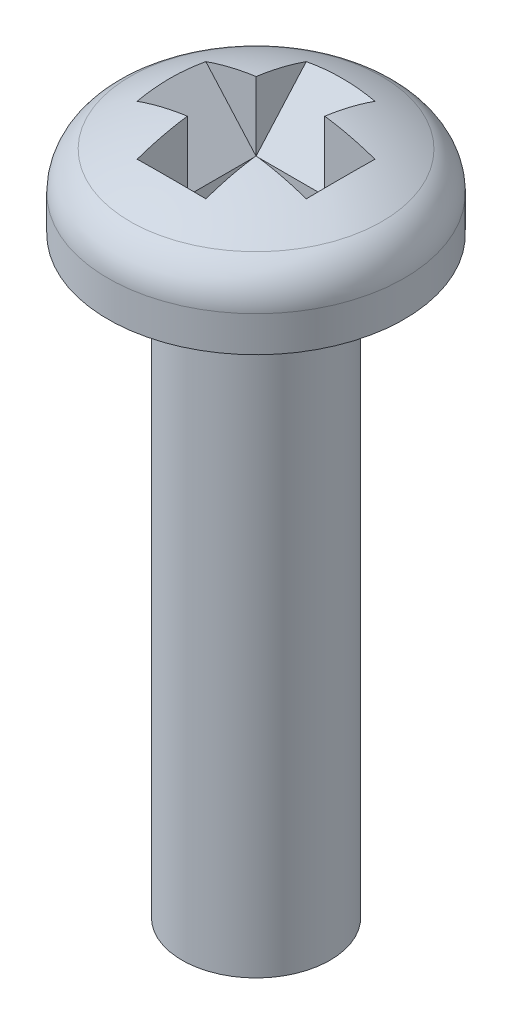
ISO-10303-21;
HEADER;
FILE_DESCRIPTION(('STEP AP214'),'2;1');
FILE_NAME('part.step','',(''),(''),'','','');
FILE_SCHEMA(('AUTOMOTIVE_DESIGN { 1 0 10303 214 1 1 1 1 }'));
ENDSEC;
DATA;
#1=APPLICATION_CONTEXT('core data for automotive mechanical design processes');
#2=APPLICATION_PROTOCOL_DEFINITION('international standard','automotive_design',2000,#1);
#3=PRODUCT_CONTEXT('',#1,'mechanical');
#4=PRODUCT('Part','Part','',(#3));
#5=PRODUCT_RELATED_PRODUCT_CATEGORY('part','',(#4));
#6=PRODUCT_DEFINITION_FORMATION('','',#4);
#7=PRODUCT_DEFINITION_CONTEXT('part definition',#1,'design');
#8=PRODUCT_DEFINITION('design','',#6,#7);
#9=PRODUCT_DEFINITION_SHAPE('','',#8);
#10=(LENGTH_UNIT() NAMED_UNIT(*) SI_UNIT(.MILLI.,.METRE.));
#11=(NAMED_UNIT(*) PLANE_ANGLE_UNIT() SI_UNIT($,.RADIAN.));
#12=(NAMED_UNIT(*) SI_UNIT($,.STERADIAN.) SOLID_ANGLE_UNIT());
#13=UNCERTAINTY_MEASURE_WITH_UNIT(LENGTH_MEASURE(1.E-05),#10,'distance_accuracy_value','');
#14=(GEOMETRIC_REPRESENTATION_CONTEXT(3) GLOBAL_UNCERTAINTY_ASSIGNED_CONTEXT((#13)) GLOBAL_UNIT_ASSIGNED_CONTEXT((#10,
#11,#12)) REPRESENTATION_CONTEXT('',''));
#15=CARTESIAN_POINT('',(0.,0.,0.));
#16=DIRECTION('',(0.,0.,1.));
#17=DIRECTION('',(1.,0.,0.));
#18=AXIS2_PLACEMENT_3D('',#15,#16,#17);
#19=CARTESIAN_POINT('',(4.038596502,4.44499615,-0.736599362));
#20=DIRECTION('',(-0.749473211781886,0.662034670407332,0.));
#21=DIRECTION('',(-0.662034670407332,-0.749473211781886,0.));
#22=AXIS2_PLACEMENT_3D('',#19,#20,#21);
#23=PLANE('',#22);
#24=DIRECTION('',(-0.662034670407332,-0.749473211781886,0.));
#25=VECTOR('',#24,1.);
#26=CARTESIAN_POINT('',(4.038596502,4.44499615,-0.736599362));
#27=LINE('',#26,#25);
#28=CARTESIAN_POINT('',(1.81311363816756,1.92558158717082,-0.736599362));
#29=VERTEX_POINT('',#28);
#30=CARTESIAN_POINT('',(0.736599362,0.706886180188679,-0.736599362));
#31=VERTEX_POINT('',#30);
#32=EDGE_CURVE('E179',#29,#31,#27,.T.);
#33=ORIENTED_EDGE('',*,*,#32,.T.);
#34=DIRECTION('',(0.,0.,1.));
#35=VECTOR('',#34,1.);
#36=CARTESIAN_POINT('',(0.736599362,0.706886180188679,-0.736599362));
#37=LINE('',#36,#35);
#38=CARTESIAN_POINT('',(0.736599362,0.706886180188679,0.736599362));
#39=VERTEX_POINT('',#38);
#40=EDGE_CURVE('E136',#31,#39,#37,.T.);
#41=ORIENTED_EDGE('',*,*,#40,.T.);
#42=DIRECTION('',(-0.662034670407332,-0.749473211781886,0.));
#43=VECTOR('',#42,1.);
#44=CARTESIAN_POINT('',(4.038596502,4.44499615,0.736599362));
#45=LINE('',#44,#43);
#46=CARTESIAN_POINT('',(1.81311363816756,1.92558158717082,0.736599362));
#47=VERTEX_POINT('',#46);
#48=EDGE_CURVE('E187',#47,#39,#45,.T.);
#49=ORIENTED_EDGE('',*,*,#48,.F.);
#50=CARTESIAN_POINT('',(-1.5284355394355,-1.8573042742666,0.));
#51=DIRECTION('',(-0.749473211781886,0.662034670407332,0.));
#52=DIRECTION('',(-0.662034670407332,-0.749473211781886,0.));
#53=AXIS2_PLACEMENT_3D('',#50,#51,#52);
#54=CIRCLE('',#53,5.10085825789167);
#55=EDGE_CURVE('E218',#29,#47,#54,.F.);
#56=ORIENTED_EDGE('',*,*,#55,.F.);
#57=EDGE_LOOP('',(#33,#41,#49,#56));
#58=FACE_BOUND('',#57,.T.);
#59=ADVANCED_FACE('F34',(#58),#23,.T.);
#60=CARTESIAN_POINT('',(-4.038596502,6.667494225,-0.736599362));
#61=DIRECTION('',(0.,0.,-1.));
#62=DIRECTION('',(-1.,0.,0.));
#63=AXIS2_PLACEMENT_3D('',#60,#61,#62);
#64=PLANE('',#63);
#65=DIRECTION('',(0.,1.,0.));
#66=VECTOR('',#65,1.);
#67=CARTESIAN_POINT('',(0.736599362,6.667494225,-0.736599362));
#68=LINE('',#67,#66);
#69=CARTESIAN_POINT('',(0.736599362,2.18632698345188,-0.736599362));
#70=VERTEX_POINT('',#69);
#71=EDGE_CURVE('E155',#31,#70,#68,.T.);
#72=ORIENTED_EDGE('',*,*,#71,.F.);
#73=ORIENTED_EDGE('',*,*,#32,.F.);
#74=CARTESIAN_POINT('',(0.,-3.20742233410129,-0.736599362));
#75=DIRECTION('',(0.,0.,-1.));
#76=DIRECTION('',(-1.,0.,0.));
#77=AXIS2_PLACEMENT_3D('',#74,#75,#76);
#78=CIRCLE('',#77,5.44381394986126);
#79=EDGE_CURVE('E222',#29,#70,#78,.F.);
#80=ORIENTED_EDGE('',*,*,#79,.T.);
#81=EDGE_LOOP('',(#72,#73,#80));
#82=FACE_BOUND('',#81,.T.);
#83=ADVANCED_FACE('F262',(#82),#64,.F.);
#84=CARTESIAN_POINT('',(-4.038596502,6.667494225,0.736599362));
#85=DIRECTION('',(0.,0.,-1.));
#86=DIRECTION('',(-1.,0.,0.));
#87=AXIS2_PLACEMENT_3D('',#84,#85,#86);
#88=PLANE('',#87);
#89=ORIENTED_EDGE('',*,*,#48,.T.);
#90=DIRECTION('',(0.,1.,0.));
#91=VECTOR('',#90,1.);
#92=CARTESIAN_POINT('',(0.736599362,6.667494225,0.736599362));
#93=LINE('',#92,#91);
#94=CARTESIAN_POINT('',(0.736599362,2.18632698345188,0.736599362));
#95=VERTEX_POINT('',#94);
#96=EDGE_CURVE('E225',#39,#95,#93,.T.);
#97=ORIENTED_EDGE('',*,*,#96,.T.);
#98=CARTESIAN_POINT('',(0.,-3.20742233410129,0.736599362));
#99=DIRECTION('',(0.,0.,-1.));
#100=DIRECTION('',(-1.,0.,0.));
#101=AXIS2_PLACEMENT_3D('',#98,#99,#100);
#102=CIRCLE('',#101,5.44381394986126);
#103=EDGE_CURVE('E212',#47,#95,#102,.F.);
#104=ORIENTED_EDGE('',*,*,#103,.F.);
#105=EDGE_LOOP('',(#89,#97,#104));
#106=FACE_BOUND('',#105,.T.);
#107=ADVANCED_FACE('F300',(#106),#88,.T.);
#108=CARTESIAN_POINT('',(0.,0.,0.));
#109=DIRECTION('',(0.,-1.,0.));
#110=DIRECTION('',(0.,0.,-1.));
#111=AXIS2_PLACEMENT_3D('',#108,#109,#110);
#112=PLANE('',#111);
#113=CARTESIAN_POINT('',(0.,0.,0.));
#114=DIRECTION('',(0.,-1.,0.));
#115=DIRECTION('',(0.,0.,-1.));
#116=AXIS2_PLACEMENT_3D('',#113,#114,#115);
#117=CIRCLE('',#116,1.5875);
#118=CARTESIAN_POINT('',(0.,0.,-1.5875));
#119=VERTEX_POINT('',#118);
#120=EDGE_CURVE('E208',#119,#119,#117,.T.);
#121=ORIENTED_EDGE('',*,*,#120,.F.);
#122=EDGE_LOOP('',(#121));
#123=FACE_BOUND('',#122,.T.);
#124=CARTESIAN_POINT('',(0.,0.,0.));
#125=DIRECTION('',(0.,-1.,0.));
#126=DIRECTION('',(0.,0.,-1.));
#127=AXIS2_PLACEMENT_3D('',#124,#125,#126);
#128=CIRCLE('',#127,3.175);
#129=CARTESIAN_POINT('',(0.,0.,-3.175));
#130=VERTEX_POINT('',#129);
#131=EDGE_CURVE('E205',#130,#130,#128,.T.);
#132=ORIENTED_EDGE('',*,*,#131,.T.);
#133=EDGE_LOOP('',(#132));
#134=FACE_BOUND('',#133,.T.);
#135=ADVANCED_FACE('F36',(#123,#134),#112,.T.);
#136=CARTESIAN_POINT('',(0.,0.,0.));
#137=DIRECTION('',(0.,-1.,0.));
#138=DIRECTION('',(0.,0.,-1.));
#139=AXIS2_PLACEMENT_3D('',#136,#137,#138);
#140=CYLINDRICAL_SURFACE('',#139,3.175);
#141=CARTESIAN_POINT('',(0.,0.762,0.));
#142=DIRECTION('',(0.,-1.,0.));
#143=DIRECTION('',(0.,0.,-1.));
#144=AXIS2_PLACEMENT_3D('',#141,#142,#143);
#145=CIRCLE('',#144,3.175);
#146=CARTESIAN_POINT('',(0.,0.762,-3.175));
#147=VERTEX_POINT('',#146);
#148=EDGE_CURVE('E202',#147,#147,#145,.T.);
#149=ORIENTED_EDGE('',*,*,#148,.T.);
#150=EDGE_LOOP('',(#149));
#151=FACE_BOUND('',#150,.T.);
#152=ORIENTED_EDGE('',*,*,#131,.F.);
#153=EDGE_LOOP('',(#152));
#154=FACE_BOUND('',#153,.T.);
#155=ADVANCED_FACE('F307',(#151,#154),#140,.T.);
#156=CARTESIAN_POINT('',(0.,0.762,0.));
#157=DIRECTION('',(0.,-1.,0.));
#158=DIRECTION('',(0.,0.,-1.));
#159=AXIS2_PLACEMENT_3D('',#156,#157,#158);
#160=TOROIDAL_SURFACE('',#159,2.23885687143939,0.936143128560607);
#161=CARTESIAN_POINT('',(0.,1.57738726833022,0.));
#162=DIRECTION('',(0.,-1.,0.));
#163=DIRECTION('',(0.,0.,-1.));
#164=AXIS2_PLACEMENT_3D('',#161,#162,#163);
#165=CIRCLE('',#164,2.6987563819808);
#166=CARTESIAN_POINT('',(0.,1.57738726833022,-2.6987563819808));
#167=VERTEX_POINT('',#166);
#168=EDGE_CURVE('E199',#167,#167,#165,.T.);
#169=ORIENTED_EDGE('',*,*,#168,.T.);
#170=EDGE_LOOP('',(#169));
#171=FACE_BOUND('',#170,.T.);
#172=ORIENTED_EDGE('',*,*,#148,.F.);
#173=EDGE_LOOP('',(#172));
#174=FACE_BOUND('',#173,.T.);
#175=ADVANCED_FACE('F488',(#171,#174),#160,.T.);
#176=CARTESIAN_POINT('',(0.,-3.20742233410129,0.));
#177=DIRECTION('',(0.,-1.,0.));
#178=DIRECTION('',(1.,0.,0.));
#179=AXIS2_PLACEMENT_3D('',#176,#177,#178);
#180=SPHERICAL_SURFACE('',#179,5.49342233410129);
#181=CARTESIAN_POINT('',(-0.736599362,-3.20742233410129,0.));
#182=DIRECTION('',(-1.,0.,0.));
#183=DIRECTION('',(0.,0.,1.));
#184=AXIS2_PLACEMENT_3D('',#181,#182,#183);
#185=CIRCLE('',#184,5.44381394986126);
#186=CARTESIAN_POINT('',(-0.736599362,1.92558158717082,-1.81311363816756));
#187=VERTEX_POINT('',#186);
#188=CARTESIAN_POINT('',(-0.736599362,2.18632698345188,-0.736599362));
#189=VERTEX_POINT('',#188);
#190=EDGE_CURVE('E162',#187,#189,#185,.F.);
#191=ORIENTED_EDGE('',*,*,#190,.F.);
#192=CARTESIAN_POINT('',(0.,-1.8573042742666,1.5284355394355));
#193=DIRECTION('',(0.,0.662034670407332,0.749473211781886));
#194=DIRECTION('',(0.,-0.749473211781886,0.662034670407332));
#195=AXIS2_PLACEMENT_3D('',#192,#193,#194);
#196=CIRCLE('',#195,5.10085825789167);
#197=CARTESIAN_POINT('',(0.736599362,1.92558158717082,-1.81311363816756));
#198=VERTEX_POINT('',#197);
#199=EDGE_CURVE('E175',#187,#198,#196,.F.);
#200=ORIENTED_EDGE('',*,*,#199,.T.);
#201=CARTESIAN_POINT('',(0.736599362,-3.20742233410129,0.));
#202=DIRECTION('',(-1.,0.,0.));
#203=DIRECTION('',(0.,0.,1.));
#204=AXIS2_PLACEMENT_3D('',#201,#202,#203);
#205=CIRCLE('',#204,5.44381394986126);
#206=EDGE_CURVE('E156',#198,#70,#205,.F.);
#207=ORIENTED_EDGE('',*,*,#206,.T.);
#208=ORIENTED_EDGE('',*,*,#79,.F.);
#209=ORIENTED_EDGE('',*,*,#55,.T.);
#210=ORIENTED_EDGE('',*,*,#103,.T.);
#211=CARTESIAN_POINT('',(0.736599362,1.92558158717082,1.81311363816756));
#212=VERTEX_POINT('',#211);
#213=EDGE_CURVE('E152',#95,#212,#205,.F.);
#214=ORIENTED_EDGE('',*,*,#213,.T.);
#215=CARTESIAN_POINT('',(0.,-1.8573042742666,-1.5284355394355));
#216=DIRECTION('',(0.,0.662034670407332,-0.749473211781886));
#217=DIRECTION('',(0.,0.749473211781886,0.662034670407332));
#218=AXIS2_PLACEMENT_3D('',#215,#216,#217);
#219=CIRCLE('',#218,5.10085825789167);
#220=CARTESIAN_POINT('',(-0.736599362,1.92558158717082,1.81311363816756));
#221=VERTEX_POINT('',#220);
#222=EDGE_CURVE('E168',#212,#221,#219,.F.);
#223=ORIENTED_EDGE('',*,*,#222,.T.);
#224=CARTESIAN_POINT('',(-0.736599362,2.18632698345188,0.736599362));
#225=VERTEX_POINT('',#224);
#226=EDGE_CURVE('E159',#225,#221,#185,.F.);
#227=ORIENTED_EDGE('',*,*,#226,.F.);
#228=CARTESIAN_POINT('',(-1.81311363816756,1.92558158717082,0.736599362));
#229=VERTEX_POINT('',#228);
#230=EDGE_CURVE('E211',#225,#229,#102,.F.);
#231=ORIENTED_EDGE('',*,*,#230,.T.);
#232=CARTESIAN_POINT('',(1.5284355394355,-1.8573042742666,0.));
#233=DIRECTION('',(0.749473211781886,0.662034670407332,0.));
#234=DIRECTION('',(-0.662034670407332,0.749473211781886,0.));
#235=AXIS2_PLACEMENT_3D('',#232,#233,#234);
#236=CIRCLE('',#235,5.10085825789167);
#237=CARTESIAN_POINT('',(-1.81311363816756,1.92558158717082,-0.736599362));
#238=VERTEX_POINT('',#237);
#239=EDGE_CURVE('E215',#229,#238,#236,.F.);
#240=ORIENTED_EDGE('',*,*,#239,.T.);
#241=EDGE_CURVE('E221',#189,#238,#78,.F.);
#242=ORIENTED_EDGE('',*,*,#241,.F.);
#243=EDGE_LOOP('',(#191,#200,#207,#208,#209,#210,#214,#223,#227,#231,#240,#242));
#244=FACE_BOUND('',#243,.T.);
#245=ORIENTED_EDGE('',*,*,#168,.F.);
#246=EDGE_LOOP('',(#245));
#247=FACE_BOUND('',#246,.T.);
#248=ADVANCED_FACE('F238',(#244,#247),#180,.T.);
#249=CARTESIAN_POINT('',(0.,-12.7,0.));
#250=DIRECTION('',(0.,-1.,0.));
#251=DIRECTION('',(0.,0.,-1.));
#252=AXIS2_PLACEMENT_3D('',#249,#250,#251);
#253=PLANE('',#252);
#254=CARTESIAN_POINT('',(0.,-12.7,0.));
#255=DIRECTION('',(0.,-1.,0.));
#256=DIRECTION('',(0.,0.,-1.));
#257=AXIS2_PLACEMENT_3D('',#254,#255,#256);
#258=CIRCLE('',#257,1.5875);
#259=CARTESIAN_POINT('',(0.,-12.7,-1.5875));
#260=VERTEX_POINT('',#259);
#261=EDGE_CURVE('E196',#260,#260,#258,.T.);
#262=ORIENTED_EDGE('',*,*,#261,.T.);
#263=EDGE_LOOP('',(#262));
#264=FACE_BOUND('',#263,.T.);
#265=ADVANCED_FACE('F487',(#264),#253,.T.);
#266=CARTESIAN_POINT('',(0.,0.,0.));
#267=DIRECTION('',(0.,-1.,0.));
#268=DIRECTION('',(0.,0.,-1.));
#269=AXIS2_PLACEMENT_3D('',#266,#267,#268);
#270=CYLINDRICAL_SURFACE('',#269,1.5875);
#271=ORIENTED_EDGE('',*,*,#120,.T.);
#272=EDGE_LOOP('',(#271));
#273=FACE_BOUND('',#272,.T.);
#274=ORIENTED_EDGE('',*,*,#261,.F.);
#275=EDGE_LOOP('',(#274));
#276=FACE_BOUND('',#275,.T.);
#277=ADVANCED_FACE('F330',(#273,#276),#270,.T.);
#278=CARTESIAN_POINT('',(0.,-0.12699989,-0.736599362));
#279=DIRECTION('',(0.749473211781886,0.662034670407332,0.));
#280=DIRECTION('',(-0.662034670407332,0.749473211781886,0.));
#281=AXIS2_PLACEMENT_3D('',#278,#279,#280);
#282=PLANE('',#281);
#283=DIRECTION('',(0.,0.,1.));
#284=VECTOR('',#283,1.);
#285=CARTESIAN_POINT('',(-0.736599362,0.706886180188679,-0.736599362));
#286=LINE('',#285,#284);
#287=CARTESIAN_POINT('',(-0.736599362,0.706886180188679,-0.736599362));
#288=VERTEX_POINT('',#287);
#289=CARTESIAN_POINT('',(-0.736599362,0.706886180188679,0.736599362));
#290=VERTEX_POINT('',#289);
#291=EDGE_CURVE('E141',#288,#290,#286,.T.);
#292=ORIENTED_EDGE('',*,*,#291,.F.);
#293=DIRECTION('',(-0.662034670407332,0.749473211781886,0.));
#294=VECTOR('',#293,1.);
#295=CARTESIAN_POINT('',(0.,-0.12699989,-0.736599362));
#296=LINE('',#295,#294);
#297=EDGE_CURVE('E182',#288,#238,#296,.T.);
#298=ORIENTED_EDGE('',*,*,#297,.T.);
#299=ORIENTED_EDGE('',*,*,#239,.F.);
#300=DIRECTION('',(-0.662034670407332,0.749473211781886,0.));
#301=VECTOR('',#300,1.);
#302=CARTESIAN_POINT('',(0.,-0.12699989,0.736599362));
#303=LINE('',#302,#301);
#304=EDGE_CURVE('E189',#290,#229,#303,.T.);
#305=ORIENTED_EDGE('',*,*,#304,.F.);
#306=EDGE_LOOP('',(#292,#298,#299,#305));
#307=FACE_BOUND('',#306,.T.);
#308=ADVANCED_FACE('F243',(#307),#282,.T.);
#309=ORIENTED_EDGE('',*,*,#297,.F.);
#310=DIRECTION('',(0.,1.,0.));
#311=VECTOR('',#310,1.);
#312=CARTESIAN_POINT('',(-0.736599362,6.667494225,-0.736599362));
#313=LINE('',#312,#311);
#314=EDGE_CURVE('E161',#288,#189,#313,.T.);
#315=ORIENTED_EDGE('',*,*,#314,.T.);
#316=ORIENTED_EDGE('',*,*,#241,.T.);
#317=EDGE_LOOP('',(#309,#315,#316));
#318=FACE_BOUND('',#317,.T.);
#319=ADVANCED_FACE('F247',(#318),#64,.F.);
#320=DIRECTION('',(0.,1.,0.));
#321=VECTOR('',#320,1.);
#322=CARTESIAN_POINT('',(-0.736599362,6.667494225,0.736599362));
#323=LINE('',#322,#321);
#324=EDGE_CURVE('E42',#290,#225,#323,.T.);
#325=ORIENTED_EDGE('',*,*,#324,.F.);
#326=ORIENTED_EDGE('',*,*,#304,.T.);
#327=ORIENTED_EDGE('',*,*,#230,.F.);
#328=EDGE_LOOP('',(#325,#326,#327));
#329=FACE_BOUND('',#328,.T.);
#330=ADVANCED_FACE('F240',(#329),#88,.T.);
#331=CARTESIAN_POINT('',(-0.736599362,6.667494225,4.038596502));
#332=DIRECTION('',(-1.,0.,0.));
#333=DIRECTION('',(0.,0.,1.));
#334=AXIS2_PLACEMENT_3D('',#331,#332,#333);
#335=PLANE('',#334);
#336=ORIENTED_EDGE('',*,*,#226,.T.);
#337=DIRECTION('',(0.,0.749473211781886,0.662034670407332));
#338=VECTOR('',#337,1.);
#339=CARTESIAN_POINT('',(-0.736599362,-0.12699989,0.));
#340=LINE('',#339,#338);
#341=EDGE_CURVE('E56',#290,#221,#340,.T.);
#342=ORIENTED_EDGE('',*,*,#341,.F.);
#343=ORIENTED_EDGE('',*,*,#324,.T.);
#344=EDGE_LOOP('',(#336,#342,#343));
#345=FACE_BOUND('',#344,.T.);
#346=ADVANCED_FACE('F231',(#345),#335,.F.);
#347=CARTESIAN_POINT('',(0.736599362,6.667494225,4.038596502));
#348=DIRECTION('',(-1.,0.,0.));
#349=DIRECTION('',(0.,0.,1.));
#350=AXIS2_PLACEMENT_3D('',#347,#348,#349);
#351=PLANE('',#350);
#352=ORIENTED_EDGE('',*,*,#96,.F.);
#353=DIRECTION('',(0.,0.749473211781886,0.662034670407332));
#354=VECTOR('',#353,1.);
#355=CARTESIAN_POINT('',(0.736599362,-0.12699989,0.));
#356=LINE('',#355,#354);
#357=EDGE_CURVE('E148',#39,#212,#356,.T.);
#358=ORIENTED_EDGE('',*,*,#357,.T.);
#359=ORIENTED_EDGE('',*,*,#213,.F.);
#360=EDGE_LOOP('',(#352,#358,#359));
#361=FACE_BOUND('',#360,.T.);
#362=ADVANCED_FACE('F298',(#361),#351,.T.);
#363=CARTESIAN_POINT('',(-0.736599362,-0.12699989,0.));
#364=DIRECTION('',(0.,0.662034670407332,-0.749473211781886));
#365=DIRECTION('',(0.,0.749473211781886,0.662034670407332));
#366=AXIS2_PLACEMENT_3D('',#363,#364,#365);
#367=PLANE('',#366);
#368=ORIENTED_EDGE('',*,*,#357,.F.);
#369=DIRECTION('',(1.,0.,0.));
#370=VECTOR('',#369,1.);
#371=CARTESIAN_POINT('',(-4.038596502,0.70688618018868,0.736599362));
#372=LINE('',#371,#370);
#373=EDGE_CURVE('E228',#290,#39,#372,.T.);
#374=ORIENTED_EDGE('',*,*,#373,.F.);
#375=ORIENTED_EDGE('',*,*,#341,.T.);
#376=ORIENTED_EDGE('',*,*,#222,.F.);
#377=EDGE_LOOP('',(#368,#374,#375,#376));
#378=FACE_BOUND('',#377,.T.);
#379=ADVANCED_FACE('F294',(#378),#367,.T.);
#380=CARTESIAN_POINT('',(0.,-0.12699989,0.736599362));
#381=VERTEX_POINT('',#380);
#382=EDGE_CURVE('E190',#381,#290,#303,.T.);
#383=ORIENTED_EDGE('',*,*,#382,.T.);
#384=ORIENTED_EDGE('',*,*,#373,.T.);
#385=EDGE_CURVE('E178',#39,#381,#45,.T.);
#386=ORIENTED_EDGE('',*,*,#385,.T.);
#387=EDGE_LOOP('',(#383,#384,#386));
#388=FACE_BOUND('',#387,.T.);
#389=ADVANCED_FACE('F292',(#388),#88,.T.);
#390=DIRECTION('',(0.,0.,1.));
#391=VECTOR('',#390,1.);
#392=CARTESIAN_POINT('',(0.,-0.12699989,-0.736599362));
#393=LINE('',#392,#391);
#394=CARTESIAN_POINT('',(0.,-0.12699989,0.));
#395=VERTEX_POINT('',#394);
#396=EDGE_CURVE('E186',#395,#381,#393,.T.);
#397=ORIENTED_EDGE('',*,*,#396,.F.);
#398=DIRECTION('',(-0.552023438206134,0.624932194195624,0.552023438206134));
#399=VECTOR('',#398,1.);
#400=CARTESIAN_POINT('',(0.224463832486223,-0.381109889041007,-0.224463832486222));
#401=LINE('',#400,#399);
#402=EDGE_CURVE('E135',#395,#290,#401,.T.);
#403=ORIENTED_EDGE('',*,*,#402,.T.);
#404=ORIENTED_EDGE('',*,*,#382,.F.);
#405=EDGE_LOOP('',(#397,#403,#404));
#406=FACE_BOUND('',#405,.T.);
#407=ADVANCED_FACE('F290',(#406),#282,.T.);
#408=ORIENTED_EDGE('',*,*,#385,.F.);
#409=DIRECTION('',(-0.552023438206134,-0.624932194195624,-0.552023438206134));
#410=VECTOR('',#409,1.);
#411=CARTESIAN_POINT('',(2.5834516569169,2.79766236311347,2.5834516569169));
#412=LINE('',#411,#410);
#413=EDGE_CURVE('E166',#39,#395,#412,.T.);
#414=ORIENTED_EDGE('',*,*,#413,.T.);
#415=ORIENTED_EDGE('',*,*,#396,.T.);
#416=EDGE_LOOP('',(#408,#414,#415));
#417=FACE_BOUND('',#416,.T.);
#418=ADVANCED_FACE('F286',(#417),#23,.T.);
#419=DIRECTION('',(0.,-0.749473211781886,0.662034670407332));
#420=VECTOR('',#419,1.);
#421=CARTESIAN_POINT('',(0.736599362,4.44499615,-4.038596502));
#422=LINE('',#421,#420);
#423=EDGE_CURVE('E49',#198,#31,#422,.T.);
#424=ORIENTED_EDGE('',*,*,#423,.T.);
#425=ORIENTED_EDGE('',*,*,#71,.T.);
#426=ORIENTED_EDGE('',*,*,#206,.F.);
#427=EDGE_LOOP('',(#424,#425,#426));
#428=FACE_BOUND('',#427,.T.);
#429=ADVANCED_FACE('F321',(#428),#351,.T.);
#430=ORIENTED_EDGE('',*,*,#190,.T.);
#431=ORIENTED_EDGE('',*,*,#314,.F.);
#432=DIRECTION('',(0.,-0.749473211781886,0.662034670407332));
#433=VECTOR('',#432,1.);
#434=CARTESIAN_POINT('',(-0.736599362,4.44499615,-4.038596502));
#435=LINE('',#434,#433);
#436=EDGE_CURVE('E125',#187,#288,#435,.T.);
#437=ORIENTED_EDGE('',*,*,#436,.F.);
#438=EDGE_LOOP('',(#430,#431,#437));
#439=FACE_BOUND('',#438,.T.);
#440=ADVANCED_FACE('F251',(#439),#335,.F.);
#441=CARTESIAN_POINT('',(-0.736599362,4.44499615,-4.038596502));
#442=DIRECTION('',(0.,0.662034670407332,0.749473211781886));
#443=DIRECTION('',(0.,-0.749473211781886,0.662034670407332));
#444=AXIS2_PLACEMENT_3D('',#441,#442,#443);
#445=PLANE('',#444);
#446=ORIENTED_EDGE('',*,*,#436,.T.);
#447=DIRECTION('',(1.,0.,0.));
#448=VECTOR('',#447,1.);
#449=CARTESIAN_POINT('',(-4.038596502,0.706886180188678,-0.736599362));
#450=LINE('',#449,#448);
#451=EDGE_CURVE('E11',#288,#31,#450,.T.);
#452=ORIENTED_EDGE('',*,*,#451,.T.);
#453=ORIENTED_EDGE('',*,*,#423,.F.);
#454=ORIENTED_EDGE('',*,*,#199,.F.);
#455=EDGE_LOOP('',(#446,#452,#453,#454));
#456=FACE_BOUND('',#455,.T.);
#457=ADVANCED_FACE('F254',(#456),#445,.T.);
#458=ORIENTED_EDGE('',*,*,#451,.F.);
#459=CARTESIAN_POINT('',(0.,-0.12699989,-0.736599362));
#460=VERTEX_POINT('',#459);
#461=EDGE_CURVE('E184',#460,#288,#296,.T.);
#462=ORIENTED_EDGE('',*,*,#461,.F.);
#463=EDGE_CURVE('E183',#31,#460,#27,.T.);
#464=ORIENTED_EDGE('',*,*,#463,.F.);
#465=EDGE_LOOP('',(#458,#462,#464));
#466=FACE_BOUND('',#465,.T.);
#467=ADVANCED_FACE('F269',(#466),#64,.F.);
#468=ORIENTED_EDGE('',*,*,#461,.T.);
#469=DIRECTION('',(0.552023438206134,-0.624932194195624,0.552023438206134));
#470=VECTOR('',#469,1.);
#471=CARTESIAN_POINT('',(-0.224463832486222,0.127110109041007,-0.224463832486223));
#472=LINE('',#471,#470);
#473=EDGE_CURVE('E120',#288,#395,#472,.T.);
#474=ORIENTED_EDGE('',*,*,#473,.T.);
#475=EDGE_CURVE('E193',#460,#395,#393,.T.);
#476=ORIENTED_EDGE('',*,*,#475,.F.);
#477=EDGE_LOOP('',(#468,#474,#476));
#478=FACE_BOUND('',#477,.T.);
#479=ADVANCED_FACE('F319',(#478),#282,.T.);
#480=ORIENTED_EDGE('',*,*,#475,.T.);
#481=DIRECTION('',(0.552023438206134,0.624932194195624,-0.552023438206134));
#482=VECTOR('',#481,1.);
#483=CARTESIAN_POINT('',(3.03237932188935,3.30588236119549,-3.03237932188935));
#484=LINE('',#483,#482);
#485=EDGE_CURVE('E172',#395,#31,#484,.T.);
#486=ORIENTED_EDGE('',*,*,#485,.T.);
#487=ORIENTED_EDGE('',*,*,#463,.T.);
#488=EDGE_LOOP('',(#480,#486,#487));
#489=FACE_BOUND('',#488,.T.);
#490=ADVANCED_FACE('F273',(#489),#23,.T.);
#491=ORIENTED_EDGE('',*,*,#291,.T.);
#492=CARTESIAN_POINT('',(-0.736599362,-0.12699989,0.));
#493=VERTEX_POINT('',#492);
#494=EDGE_CURVE('E132',#493,#290,#340,.T.);
#495=ORIENTED_EDGE('',*,*,#494,.F.);
#496=EDGE_CURVE('E114',#288,#493,#435,.T.);
#497=ORIENTED_EDGE('',*,*,#496,.F.);
#498=EDGE_LOOP('',(#491,#495,#497));
#499=FACE_BOUND('',#498,.T.);
#500=ADVANCED_FACE('F139',(#499),#335,.F.);
#501=DIRECTION('',(1.,0.,0.));
#502=VECTOR('',#501,1.);
#503=CARTESIAN_POINT('',(-0.736599362,-0.12699989,0.));
#504=LINE('',#503,#502);
#505=EDGE_CURVE('E117',#493,#395,#504,.T.);
#506=ORIENTED_EDGE('',*,*,#505,.F.);
#507=ORIENTED_EDGE('',*,*,#494,.T.);
#508=ORIENTED_EDGE('',*,*,#402,.F.);
#509=EDGE_LOOP('',(#506,#507,#508));
#510=FACE_BOUND('',#509,.T.);
#511=ADVANCED_FACE('F131',(#510),#367,.T.);
#512=ORIENTED_EDGE('',*,*,#496,.T.);
#513=ORIENTED_EDGE('',*,*,#505,.T.);
#514=ORIENTED_EDGE('',*,*,#473,.F.);
#515=EDGE_LOOP('',(#512,#513,#514));
#516=FACE_BOUND('',#515,.T.);
#517=ADVANCED_FACE('F116',(#516),#445,.T.);
#518=CARTESIAN_POINT('',(0.736599362,-0.12699989,0.));
#519=VERTEX_POINT('',#518);
#520=EDGE_CURVE('E137',#395,#519,#504,.T.);
#521=ORIENTED_EDGE('',*,*,#520,.T.);
#522=EDGE_CURVE('E144',#31,#519,#422,.T.);
#523=ORIENTED_EDGE('',*,*,#522,.F.);
#524=ORIENTED_EDGE('',*,*,#485,.F.);
#525=EDGE_LOOP('',(#521,#523,#524));
#526=FACE_BOUND('',#525,.T.);
#527=ADVANCED_FACE('F276',(#526),#445,.T.);
#528=EDGE_CURVE('E126',#519,#39,#356,.T.);
#529=ORIENTED_EDGE('',*,*,#528,.F.);
#530=ORIENTED_EDGE('',*,*,#520,.F.);
#531=ORIENTED_EDGE('',*,*,#413,.F.);
#532=EDGE_LOOP('',(#529,#530,#531));
#533=FACE_BOUND('',#532,.T.);
#534=ADVANCED_FACE('F283',(#533),#367,.T.);
#535=ORIENTED_EDGE('',*,*,#522,.T.);
#536=ORIENTED_EDGE('',*,*,#528,.T.);
#537=ORIENTED_EDGE('',*,*,#40,.F.);
#538=EDGE_LOOP('',(#535,#536,#537));
#539=FACE_BOUND('',#538,.T.);
#540=ADVANCED_FACE('F279',(#539),#351,.T.);
#541=CLOSED_SHELL('',(#59,#83,#107,#135,#155,#175,#248,#265,#277,#308,#319,#330,#346,#362,#379,
#389,#407,#418,#429,#440,#457,#467,#479,#490,#500,#511,#517,#527,#534,#540));
#542=MANIFOLD_SOLID_BREP('B2',#541);
#543=ADVANCED_BREP_SHAPE_REPRESENTATION('',(#18,#542),#14);
#544=SHAPE_DEFINITION_REPRESENTATION(#9,#543);
ENDSEC;
END-ISO-10303-21;
